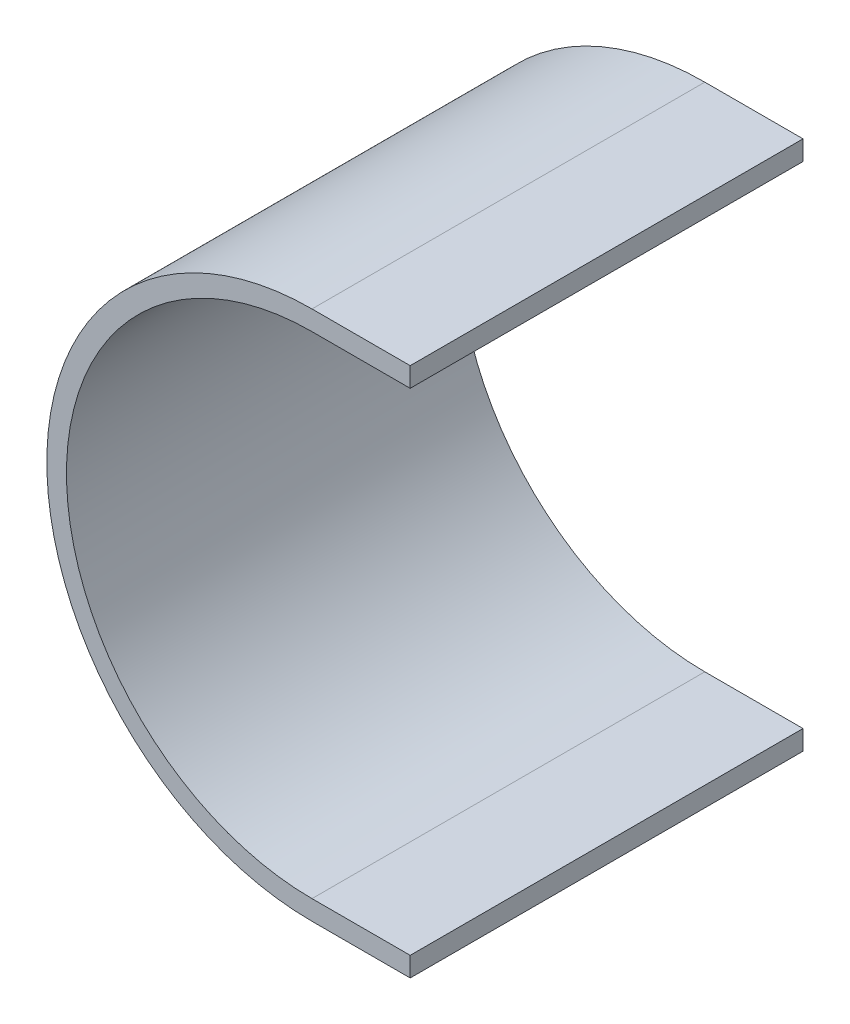
ISO-10303-21;
HEADER;
FILE_DESCRIPTION(('STEP AP214'),'2;1');
FILE_NAME('part.step','',(''),(''),'','','');
FILE_SCHEMA(('AUTOMOTIVE_DESIGN { 1 0 10303 214 1 1 1 1 }'));
ENDSEC;
DATA;
#1=APPLICATION_CONTEXT('core data for automotive mechanical design processes');
#2=APPLICATION_PROTOCOL_DEFINITION('international standard','automotive_design',2000,#1);
#3=PRODUCT_CONTEXT('',#1,'mechanical');
#4=PRODUCT('Part','Part','',(#3));
#5=PRODUCT_RELATED_PRODUCT_CATEGORY('part','',(#4));
#6=PRODUCT_DEFINITION_FORMATION('','',#4);
#7=PRODUCT_DEFINITION_CONTEXT('part definition',#1,'design');
#8=PRODUCT_DEFINITION('design','',#6,#7);
#9=PRODUCT_DEFINITION_SHAPE('','',#8);
#10=(LENGTH_UNIT() NAMED_UNIT(*) SI_UNIT(.MILLI.,.METRE.));
#11=(NAMED_UNIT(*) PLANE_ANGLE_UNIT() SI_UNIT($,.RADIAN.));
#12=(NAMED_UNIT(*) SI_UNIT($,.STERADIAN.) SOLID_ANGLE_UNIT());
#13=UNCERTAINTY_MEASURE_WITH_UNIT(LENGTH_MEASURE(1.E-05),#10,'distance_accuracy_value','');
#14=(GEOMETRIC_REPRESENTATION_CONTEXT(3) GLOBAL_UNCERTAINTY_ASSIGNED_CONTEXT((#13)) GLOBAL_UNIT_ASSIGNED_CONTEXT((#10,
#11,#12)) REPRESENTATION_CONTEXT('',''));
#15=CARTESIAN_POINT('',(0.,0.,0.));
#16=DIRECTION('',(0.,0.,1.));
#17=DIRECTION('',(1.,0.,0.));
#18=AXIS2_PLACEMENT_3D('',#15,#16,#17);
#19=CARTESIAN_POINT('',(30.,81.,120.));
#20=DIRECTION('',(-1.,0.,0.));
#21=DIRECTION('',(0.,-1.,0.));
#22=AXIS2_PLACEMENT_3D('',#19,#20,#21);
#23=PLANE('',#22);
#24=DIRECTION('',(0.,1.,0.));
#25=VECTOR('',#24,1.);
#26=CARTESIAN_POINT('',(30.,81.,0.));
#27=LINE('',#26,#25);
#28=CARTESIAN_POINT('',(30.,75.,0.));
#29=VERTEX_POINT('',#28);
#30=CARTESIAN_POINT('',(30.,81.,0.));
#31=VERTEX_POINT('',#30);
#32=EDGE_CURVE('E129',#29,#31,#27,.T.);
#33=ORIENTED_EDGE('',*,*,#32,.T.);
#34=DIRECTION('',(0.,0.,-1.));
#35=VECTOR('',#34,1.);
#36=CARTESIAN_POINT('',(30.,81.,120.));
#37=LINE('',#36,#35);
#38=CARTESIAN_POINT('',(30.,81.,120.));
#39=VERTEX_POINT('',#38);
#40=EDGE_CURVE('E11',#39,#31,#37,.T.);
#41=ORIENTED_EDGE('',*,*,#40,.F.);
#42=DIRECTION('',(0.,1.,0.));
#43=VECTOR('',#42,1.);
#44=CARTESIAN_POINT('',(30.,81.,120.));
#45=LINE('',#44,#43);
#46=CARTESIAN_POINT('',(30.,75.,120.));
#47=VERTEX_POINT('',#46);
#48=EDGE_CURVE('E143',#47,#39,#45,.T.);
#49=ORIENTED_EDGE('',*,*,#48,.F.);
#50=DIRECTION('',(0.,0.,-1.));
#51=VECTOR('',#50,1.);
#52=CARTESIAN_POINT('',(30.,75.,120.));
#53=LINE('',#52,#51);
#54=EDGE_CURVE('E125',#47,#29,#53,.T.);
#55=ORIENTED_EDGE('',*,*,#54,.T.);
#56=EDGE_LOOP('',(#33,#41,#49,#55));
#57=FACE_BOUND('',#56,.T.);
#58=ADVANCED_FACE('F33',(#57),#23,.F.);
#59=CARTESIAN_POINT('',(0.,81.,120.));
#60=DIRECTION('',(0.,-1.,0.));
#61=DIRECTION('',(0.,0.,-1.));
#62=AXIS2_PLACEMENT_3D('',#59,#60,#61);
#63=PLANE('',#62);
#64=DIRECTION('',(-1.,0.,0.));
#65=VECTOR('',#64,1.);
#66=CARTESIAN_POINT('',(0.,81.,0.));
#67=LINE('',#66,#65);
#68=CARTESIAN_POINT('',(0.,81.,0.));
#69=VERTEX_POINT('',#68);
#70=EDGE_CURVE('E132',#31,#69,#67,.T.);
#71=ORIENTED_EDGE('',*,*,#70,.T.);
#72=DIRECTION('',(0.,0.,-1.));
#73=VECTOR('',#72,1.);
#74=CARTESIAN_POINT('',(0.,81.,120.));
#75=LINE('',#74,#73);
#76=CARTESIAN_POINT('',(0.,81.,120.));
#77=VERTEX_POINT('',#76);
#78=EDGE_CURVE('E41',#77,#69,#75,.T.);
#79=ORIENTED_EDGE('',*,*,#78,.F.);
#80=DIRECTION('',(-1.,0.,0.));
#81=VECTOR('',#80,1.);
#82=CARTESIAN_POINT('',(0.,81.,120.));
#83=LINE('',#82,#81);
#84=EDGE_CURVE('E92',#39,#77,#83,.T.);
#85=ORIENTED_EDGE('',*,*,#84,.F.);
#86=ORIENTED_EDGE('',*,*,#40,.T.);
#87=EDGE_LOOP('',(#71,#79,#85,#86));
#88=FACE_BOUND('',#87,.T.);
#89=ADVANCED_FACE('F178',(#88),#63,.F.);
#90=CARTESIAN_POINT('',(0.,0.,120.));
#91=DIRECTION('',(0.,0.,-1.));
#92=DIRECTION('',(-1.,0.,0.));
#93=AXIS2_PLACEMENT_3D('',#90,#91,#92);
#94=CYLINDRICAL_SURFACE('',#93,81.);
#95=CARTESIAN_POINT('',(0.,0.,0.));
#96=DIRECTION('',(0.,0.,1.));
#97=DIRECTION('',(1.,0.,0.));
#98=AXIS2_PLACEMENT_3D('',#95,#96,#97);
#99=CIRCLE('',#98,81.);
#100=CARTESIAN_POINT('',(0.,-81.,0.));
#101=VERTEX_POINT('',#100);
#102=EDGE_CURVE('E134',#69,#101,#99,.T.);
#103=ORIENTED_EDGE('',*,*,#102,.T.);
#104=DIRECTION('',(0.,0.,-1.));
#105=VECTOR('',#104,1.);
#106=CARTESIAN_POINT('',(0.,-81.,120.));
#107=LINE('',#106,#105);
#108=CARTESIAN_POINT('',(0.,-81.,120.));
#109=VERTEX_POINT('',#108);
#110=EDGE_CURVE('E150',#109,#101,#107,.T.);
#111=ORIENTED_EDGE('',*,*,#110,.F.);
#112=CARTESIAN_POINT('',(0.,0.,120.));
#113=DIRECTION('',(0.,0.,1.));
#114=DIRECTION('',(1.,0.,0.));
#115=AXIS2_PLACEMENT_3D('',#112,#113,#114);
#116=CIRCLE('',#115,81.);
#117=EDGE_CURVE('E158',#77,#109,#116,.T.);
#118=ORIENTED_EDGE('',*,*,#117,.F.);
#119=ORIENTED_EDGE('',*,*,#78,.T.);
#120=EDGE_LOOP('',(#103,#111,#118,#119));
#121=FACE_BOUND('',#120,.T.);
#122=ADVANCED_FACE('F156',(#121),#94,.T.);
#123=CARTESIAN_POINT('',(0.,-81.,120.));
#124=DIRECTION('',(0.,1.,0.));
#125=DIRECTION('',(0.,0.,1.));
#126=AXIS2_PLACEMENT_3D('',#123,#124,#125);
#127=PLANE('',#126);
#128=DIRECTION('',(1.,0.,0.));
#129=VECTOR('',#128,1.);
#130=CARTESIAN_POINT('',(0.,-81.,0.));
#131=LINE('',#130,#129);
#132=CARTESIAN_POINT('',(30.,-81.,0.));
#133=VERTEX_POINT('',#132);
#134=EDGE_CURVE('E136',#101,#133,#131,.T.);
#135=ORIENTED_EDGE('',*,*,#134,.T.);
#136=DIRECTION('',(0.,0.,-1.));
#137=VECTOR('',#136,1.);
#138=CARTESIAN_POINT('',(30.,-81.,120.));
#139=LINE('',#138,#137);
#140=CARTESIAN_POINT('',(30.,-81.,120.));
#141=VERTEX_POINT('',#140);
#142=EDGE_CURVE('E147',#141,#133,#139,.T.);
#143=ORIENTED_EDGE('',*,*,#142,.F.);
#144=DIRECTION('',(1.,0.,0.));
#145=VECTOR('',#144,1.);
#146=CARTESIAN_POINT('',(0.,-81.,120.));
#147=LINE('',#146,#145);
#148=EDGE_CURVE('E170',#109,#141,#147,.T.);
#149=ORIENTED_EDGE('',*,*,#148,.F.);
#150=ORIENTED_EDGE('',*,*,#110,.T.);
#151=EDGE_LOOP('',(#135,#143,#149,#150));
#152=FACE_BOUND('',#151,.T.);
#153=ADVANCED_FACE('F166',(#152),#127,.F.);
#154=CARTESIAN_POINT('',(30.,-81.,120.));
#155=DIRECTION('',(-1.,0.,0.));
#156=DIRECTION('',(0.,0.,1.));
#157=AXIS2_PLACEMENT_3D('',#154,#155,#156);
#158=PLANE('',#157);
#159=DIRECTION('',(0.,1.,0.));
#160=VECTOR('',#159,1.);
#161=CARTESIAN_POINT('',(30.,-81.,0.));
#162=LINE('',#161,#160);
#163=CARTESIAN_POINT('',(30.,-75.,0.));
#164=VERTEX_POINT('',#163);
#165=EDGE_CURVE('E138',#133,#164,#162,.T.);
#166=ORIENTED_EDGE('',*,*,#165,.T.);
#167=DIRECTION('',(0.,0.,-1.));
#168=VECTOR('',#167,1.);
#169=CARTESIAN_POINT('',(30.,-75.,120.));
#170=LINE('',#169,#168);
#171=CARTESIAN_POINT('',(30.,-75.,120.));
#172=VERTEX_POINT('',#171);
#173=EDGE_CURVE('E120',#172,#164,#170,.T.);
#174=ORIENTED_EDGE('',*,*,#173,.F.);
#175=DIRECTION('',(0.,1.,0.));
#176=VECTOR('',#175,1.);
#177=CARTESIAN_POINT('',(30.,-81.,120.));
#178=LINE('',#177,#176);
#179=EDGE_CURVE('E111',#141,#172,#178,.T.);
#180=ORIENTED_EDGE('',*,*,#179,.F.);
#181=ORIENTED_EDGE('',*,*,#142,.T.);
#182=EDGE_LOOP('',(#166,#174,#180,#181));
#183=FACE_BOUND('',#182,.T.);
#184=ADVANCED_FACE('F169',(#183),#158,.F.);
#185=CARTESIAN_POINT('',(0.,-75.,120.));
#186=DIRECTION('',(0.,-1.,0.));
#187=DIRECTION('',(0.,0.,-1.));
#188=AXIS2_PLACEMENT_3D('',#185,#186,#187);
#189=PLANE('',#188);
#190=DIRECTION('',(-1.,0.,0.));
#191=VECTOR('',#190,1.);
#192=CARTESIAN_POINT('',(0.,-75.,0.));
#193=LINE('',#192,#191);
#194=CARTESIAN_POINT('',(0.,-75.,0.));
#195=VERTEX_POINT('',#194);
#196=EDGE_CURVE('E119',#164,#195,#193,.T.);
#197=ORIENTED_EDGE('',*,*,#196,.T.);
#198=DIRECTION('',(0.,0.,-1.));
#199=VECTOR('',#198,1.);
#200=CARTESIAN_POINT('',(0.,-75.,120.));
#201=LINE('',#200,#199);
#202=CARTESIAN_POINT('',(0.,-75.,120.));
#203=VERTEX_POINT('',#202);
#204=EDGE_CURVE('E116',#203,#195,#201,.T.);
#205=ORIENTED_EDGE('',*,*,#204,.F.);
#206=DIRECTION('',(-1.,0.,0.));
#207=VECTOR('',#206,1.);
#208=CARTESIAN_POINT('',(0.,-75.,120.));
#209=LINE('',#208,#207);
#210=EDGE_CURVE('E105',#172,#203,#209,.T.);
#211=ORIENTED_EDGE('',*,*,#210,.F.);
#212=ORIENTED_EDGE('',*,*,#173,.T.);
#213=EDGE_LOOP('',(#197,#205,#211,#212));
#214=FACE_BOUND('',#213,.T.);
#215=ADVANCED_FACE('F117',(#214),#189,.F.);
#216=CARTESIAN_POINT('',(0.,0.,120.));
#217=DIRECTION('',(0.,0.,-1.));
#218=DIRECTION('',(-1.,0.,0.));
#219=AXIS2_PLACEMENT_3D('',#216,#217,#218);
#220=CYLINDRICAL_SURFACE('',#219,75.);
#221=CARTESIAN_POINT('',(0.,0.,0.));
#222=DIRECTION('',(0.,0.,-1.));
#223=DIRECTION('',(1.,0.,0.));
#224=AXIS2_PLACEMENT_3D('',#221,#222,#223);
#225=CIRCLE('',#224,75.);
#226=CARTESIAN_POINT('',(0.,75.,0.));
#227=VERTEX_POINT('',#226);
#228=EDGE_CURVE('E78',#195,#227,#225,.T.);
#229=ORIENTED_EDGE('',*,*,#228,.T.);
#230=DIRECTION('',(0.,0.,-1.));
#231=VECTOR('',#230,1.);
#232=CARTESIAN_POINT('',(0.,75.,120.));
#233=LINE('',#232,#231);
#234=CARTESIAN_POINT('',(0.,75.,120.));
#235=VERTEX_POINT('',#234);
#236=EDGE_CURVE('E121',#235,#227,#233,.T.);
#237=ORIENTED_EDGE('',*,*,#236,.F.);
#238=CARTESIAN_POINT('',(0.,0.,120.));
#239=DIRECTION('',(0.,0.,-1.));
#240=DIRECTION('',(1.,0.,0.));
#241=AXIS2_PLACEMENT_3D('',#238,#239,#240);
#242=CIRCLE('',#241,75.);
#243=EDGE_CURVE('E109',#203,#235,#242,.T.);
#244=ORIENTED_EDGE('',*,*,#243,.F.);
#245=ORIENTED_EDGE('',*,*,#204,.T.);
#246=EDGE_LOOP('',(#229,#237,#244,#245));
#247=FACE_BOUND('',#246,.T.);
#248=ADVANCED_FACE('F123',(#247),#220,.F.);
#249=CARTESIAN_POINT('',(0.,75.,120.));
#250=DIRECTION('',(0.,1.,0.));
#251=DIRECTION('',(-1.,0.,0.));
#252=AXIS2_PLACEMENT_3D('',#249,#250,#251);
#253=PLANE('',#252);
#254=DIRECTION('',(1.,0.,0.));
#255=VECTOR('',#254,1.);
#256=CARTESIAN_POINT('',(0.,75.,0.));
#257=LINE('',#256,#255);
#258=EDGE_CURVE('E84',#227,#29,#257,.T.);
#259=ORIENTED_EDGE('',*,*,#258,.T.);
#260=ORIENTED_EDGE('',*,*,#54,.F.);
#261=DIRECTION('',(1.,0.,0.));
#262=VECTOR('',#261,1.);
#263=CARTESIAN_POINT('',(0.,75.,120.));
#264=LINE('',#263,#262);
#265=EDGE_CURVE('E49',#235,#47,#264,.T.);
#266=ORIENTED_EDGE('',*,*,#265,.F.);
#267=ORIENTED_EDGE('',*,*,#236,.T.);
#268=EDGE_LOOP('',(#259,#260,#266,#267));
#269=FACE_BOUND('',#268,.T.);
#270=ADVANCED_FACE('F194',(#269),#253,.F.);
#271=CARTESIAN_POINT('',(0.,0.,120.));
#272=DIRECTION('',(0.,0.,1.));
#273=DIRECTION('',(1.,0.,0.));
#274=AXIS2_PLACEMENT_3D('',#271,#272,#273);
#275=PLANE('',#274);
#276=ORIENTED_EDGE('',*,*,#48,.T.);
#277=ORIENTED_EDGE('',*,*,#84,.T.);
#278=ORIENTED_EDGE('',*,*,#117,.T.);
#279=ORIENTED_EDGE('',*,*,#148,.T.);
#280=ORIENTED_EDGE('',*,*,#179,.T.);
#281=ORIENTED_EDGE('',*,*,#210,.T.);
#282=ORIENTED_EDGE('',*,*,#243,.T.);
#283=ORIENTED_EDGE('',*,*,#265,.T.);
#284=EDGE_LOOP('',(#276,#277,#278,#279,#280,#281,#282,#283));
#285=FACE_BOUND('',#284,.T.);
#286=ADVANCED_FACE('F107',(#285),#275,.T.);
#287=CARTESIAN_POINT('',(0.,0.,0.));
#288=DIRECTION('',(0.,0.,1.));
#289=DIRECTION('',(1.,0.,0.));
#290=AXIS2_PLACEMENT_3D('',#287,#288,#289);
#291=PLANE('',#290);
#292=ORIENTED_EDGE('',*,*,#32,.F.);
#293=ORIENTED_EDGE('',*,*,#258,.F.);
#294=ORIENTED_EDGE('',*,*,#228,.F.);
#295=ORIENTED_EDGE('',*,*,#196,.F.);
#296=ORIENTED_EDGE('',*,*,#165,.F.);
#297=ORIENTED_EDGE('',*,*,#134,.F.);
#298=ORIENTED_EDGE('',*,*,#102,.F.);
#299=ORIENTED_EDGE('',*,*,#70,.F.);
#300=EDGE_LOOP('',(#292,#293,#294,#295,#296,#297,#298,#299));
#301=FACE_BOUND('',#300,.T.);
#302=ADVANCED_FACE('F162',(#301),#291,.F.);
#303=CLOSED_SHELL('',(#58,#89,#122,#153,#184,#215,#248,#270,#286,#302));
#304=MANIFOLD_SOLID_BREP('B2',#303);
#305=ADVANCED_BREP_SHAPE_REPRESENTATION('',(#18,#304),#14);
#306=SHAPE_DEFINITION_REPRESENTATION(#9,#305);
ENDSEC;
END-ISO-10303-21;
